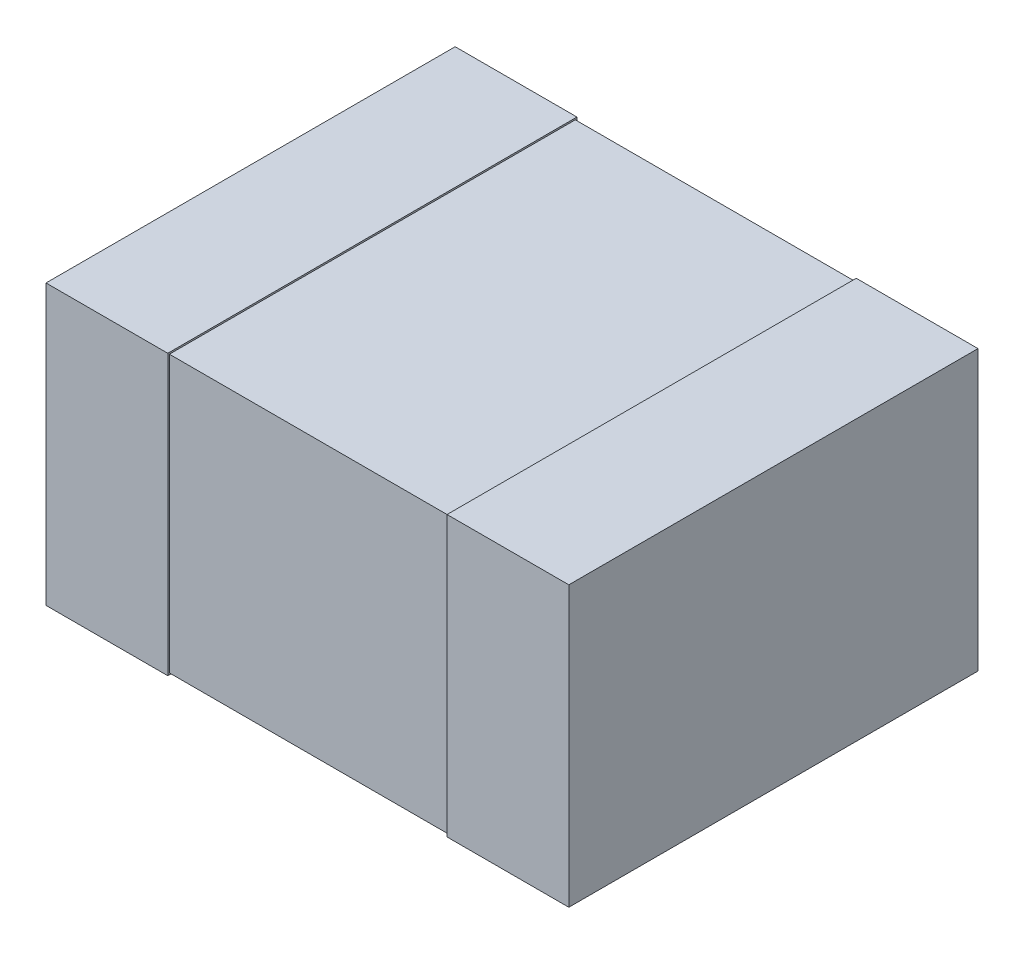
ISO-10303-21;
HEADER;
FILE_DESCRIPTION(('STEP AP214'),'2;1');
FILE_NAME('part.step','',(''),(''),'','','');
FILE_SCHEMA(('AUTOMOTIVE_DESIGN { 1 0 10303 214 1 1 1 1 }'));
ENDSEC;
DATA;
#1=APPLICATION_CONTEXT('core data for automotive mechanical design processes');
#2=APPLICATION_PROTOCOL_DEFINITION('international standard','automotive_design',2000,#1);
#3=PRODUCT_CONTEXT('',#1,'mechanical');
#4=PRODUCT('Part','Part','',(#3));
#5=PRODUCT_RELATED_PRODUCT_CATEGORY('part','',(#4));
#6=PRODUCT_DEFINITION_FORMATION('','',#4);
#7=PRODUCT_DEFINITION_CONTEXT('part definition',#1,'design');
#8=PRODUCT_DEFINITION('design','',#6,#7);
#9=PRODUCT_DEFINITION_SHAPE('','',#8);
#10=(LENGTH_UNIT() NAMED_UNIT(*) SI_UNIT(.MILLI.,.METRE.));
#11=(NAMED_UNIT(*) PLANE_ANGLE_UNIT() SI_UNIT($,.RADIAN.));
#12=(NAMED_UNIT(*) SI_UNIT($,.STERADIAN.) SOLID_ANGLE_UNIT());
#13=UNCERTAINTY_MEASURE_WITH_UNIT(LENGTH_MEASURE(1.E-05),#10,'distance_accuracy_value','');
#14=(GEOMETRIC_REPRESENTATION_CONTEXT(3) GLOBAL_UNCERTAINTY_ASSIGNED_CONTEXT((#13)) GLOBAL_UNIT_ASSIGNED_CONTEXT((#10,
#11,#12)) REPRESENTATION_CONTEXT('',''));
#15=CARTESIAN_POINT('',(0.,0.,0.));
#16=DIRECTION('',(0.,0.,1.));
#17=DIRECTION('',(1.,0.,0.));
#18=AXIS2_PLACEMENT_3D('',#15,#16,#17);
#19=CARTESIAN_POINT('',(1.61,1.71,-1.26));
#20=DIRECTION('',(-1.,0.,0.));
#21=DIRECTION('',(0.,0.,1.));
#22=AXIS2_PLACEMENT_3D('',#19,#20,#21);
#23=PLANE('',#22);
#24=DIRECTION('',(0.,0.,-1.));
#25=VECTOR('',#24,1.);
#26=CARTESIAN_POINT('',(1.61,-0.01,0.));
#27=LINE('',#26,#25);
#28=CARTESIAN_POINT('',(1.61,-0.01,-1.26));
#29=VERTEX_POINT('',#28);
#30=CARTESIAN_POINT('',(1.61,-0.01,1.26));
#31=VERTEX_POINT('',#30);
#32=EDGE_CURVE('E102',#29,#31,#27,.F.);
#33=ORIENTED_EDGE('',*,*,#32,.F.);
#34=DIRECTION('',(0.,1.,0.));
#35=VECTOR('',#34,1.);
#36=CARTESIAN_POINT('',(1.61,1.71,-1.26));
#37=LINE('',#36,#35);
#38=CARTESIAN_POINT('',(1.61,1.71,-1.26));
#39=VERTEX_POINT('',#38);
#40=EDGE_CURVE('E20',#39,#29,#37,.F.);
#41=ORIENTED_EDGE('',*,*,#40,.F.);
#42=DIRECTION('',(0.,0.,-1.));
#43=VECTOR('',#42,1.);
#44=CARTESIAN_POINT('',(1.61,1.71,0.));
#45=LINE('',#44,#43);
#46=CARTESIAN_POINT('',(1.61,1.71,1.26));
#47=VERTEX_POINT('',#46);
#48=EDGE_CURVE('E107',#39,#47,#45,.F.);
#49=ORIENTED_EDGE('',*,*,#48,.T.);
#50=DIRECTION('',(0.,1.,0.));
#51=VECTOR('',#50,1.);
#52=CARTESIAN_POINT('',(1.61,1.71,1.26));
#53=LINE('',#52,#51);
#54=EDGE_CURVE('E109',#47,#31,#53,.F.);
#55=ORIENTED_EDGE('',*,*,#54,.T.);
#56=EDGE_LOOP('',(#33,#41,#49,#55));
#57=FACE_BOUND('',#56,.T.);
#58=ADVANCED_FACE('F17',(#57),#23,.F.);
#59=CARTESIAN_POINT('',(0.,1.71,0.));
#60=DIRECTION('',(0.,-1.,0.));
#61=DIRECTION('',(0.,0.,-1.));
#62=AXIS2_PLACEMENT_3D('',#59,#60,#61);
#63=PLANE('',#62);
#64=DIRECTION('',(1.,0.,0.));
#65=VECTOR('',#64,1.);
#66=CARTESIAN_POINT('',(1.61,1.71,-1.26));
#67=LINE('',#66,#65);
#68=CARTESIAN_POINT('',(0.86,1.71,-1.26));
#69=VERTEX_POINT('',#68);
#70=EDGE_CURVE('E129',#39,#69,#67,.F.);
#71=ORIENTED_EDGE('',*,*,#70,.T.);
#72=DIRECTION('',(0.,0.,-1.));
#73=VECTOR('',#72,1.);
#74=CARTESIAN_POINT('',(0.86,1.71,-1.26));
#75=LINE('',#74,#73);
#76=CARTESIAN_POINT('',(0.86,1.71,1.26));
#77=VERTEX_POINT('',#76);
#78=EDGE_CURVE('E124',#69,#77,#75,.F.);
#79=ORIENTED_EDGE('',*,*,#78,.T.);
#80=DIRECTION('',(-1.,0.,0.));
#81=VECTOR('',#80,1.);
#82=CARTESIAN_POINT('',(1.61,1.71,1.26));
#83=LINE('',#82,#81);
#84=EDGE_CURVE('E115',#77,#47,#83,.F.);
#85=ORIENTED_EDGE('',*,*,#84,.T.);
#86=ORIENTED_EDGE('',*,*,#48,.F.);
#87=EDGE_LOOP('',(#71,#79,#85,#86));
#88=FACE_BOUND('',#87,.T.);
#89=ADVANCED_FACE('F123',(#88),#63,.F.);
#90=CARTESIAN_POINT('',(1.61,1.71,1.26));
#91=DIRECTION('',(0.,0.,-1.));
#92=DIRECTION('',(-1.,0.,0.));
#93=AXIS2_PLACEMENT_3D('',#90,#91,#92);
#94=PLANE('',#93);
#95=DIRECTION('',(1.,0.,0.));
#96=VECTOR('',#95,1.);
#97=CARTESIAN_POINT('',(0.,-0.01,1.26));
#98=LINE('',#97,#96);
#99=CARTESIAN_POINT('',(0.86,-0.01,1.26));
#100=VERTEX_POINT('',#99);
#101=EDGE_CURVE('E120',#31,#100,#98,.F.);
#102=ORIENTED_EDGE('',*,*,#101,.F.);
#103=ORIENTED_EDGE('',*,*,#54,.F.);
#104=ORIENTED_EDGE('',*,*,#84,.F.);
#105=DIRECTION('',(0.,1.,0.));
#106=VECTOR('',#105,1.);
#107=CARTESIAN_POINT('',(0.86,1.71,1.26));
#108=LINE('',#107,#106);
#109=EDGE_CURVE('E134',#77,#100,#108,.F.);
#110=ORIENTED_EDGE('',*,*,#109,.T.);
#111=EDGE_LOOP('',(#102,#103,#104,#110));
#112=FACE_BOUND('',#111,.T.);
#113=ADVANCED_FACE('F117',(#112),#94,.F.);
#114=CARTESIAN_POINT('',(0.,-0.01,0.));
#115=DIRECTION('',(0.,-1.,0.));
#116=DIRECTION('',(0.,0.,-1.));
#117=AXIS2_PLACEMENT_3D('',#114,#115,#116);
#118=PLANE('',#117);
#119=DIRECTION('',(0.,0.,-1.));
#120=VECTOR('',#119,1.);
#121=CARTESIAN_POINT('',(0.86,-0.01,-1.26));
#122=LINE('',#121,#120);
#123=CARTESIAN_POINT('',(0.86,-0.01,-1.26));
#124=VERTEX_POINT('',#123);
#125=EDGE_CURVE('E136',#100,#124,#122,.T.);
#126=ORIENTED_EDGE('',*,*,#125,.T.);
#127=DIRECTION('',(1.,0.,0.));
#128=VECTOR('',#127,1.);
#129=CARTESIAN_POINT('',(1.61,-0.01,-1.26));
#130=LINE('',#129,#128);
#131=EDGE_CURVE('E131',#124,#29,#130,.T.);
#132=ORIENTED_EDGE('',*,*,#131,.T.);
#133=ORIENTED_EDGE('',*,*,#32,.T.);
#134=ORIENTED_EDGE('',*,*,#101,.T.);
#135=EDGE_LOOP('',(#126,#132,#133,#134));
#136=FACE_BOUND('',#135,.T.);
#137=ADVANCED_FACE('F258',(#136),#118,.T.);
#138=CARTESIAN_POINT('',(1.61,1.71,-1.26));
#139=DIRECTION('',(0.,0.,1.));
#140=DIRECTION('',(1.,0.,0.));
#141=AXIS2_PLACEMENT_3D('',#138,#139,#140);
#142=PLANE('',#141);
#143=ORIENTED_EDGE('',*,*,#131,.F.);
#144=DIRECTION('',(0.,1.,0.));
#145=VECTOR('',#144,1.);
#146=CARTESIAN_POINT('',(0.86,1.71,-1.26));
#147=LINE('',#146,#145);
#148=EDGE_CURVE('E139',#124,#69,#147,.T.);
#149=ORIENTED_EDGE('',*,*,#148,.T.);
#150=ORIENTED_EDGE('',*,*,#70,.F.);
#151=ORIENTED_EDGE('',*,*,#40,.T.);
#152=EDGE_LOOP('',(#143,#149,#150,#151));
#153=FACE_BOUND('',#152,.T.);
#154=ADVANCED_FACE('F254',(#153),#142,.F.);
#155=CARTESIAN_POINT('',(0.86,1.71,-1.26));
#156=DIRECTION('',(1.,0.,0.));
#157=DIRECTION('',(0.,0.,-1.));
#158=AXIS2_PLACEMENT_3D('',#155,#156,#157);
#159=PLANE('',#158);
#160=DIRECTION('',(0.,0.,-1.));
#161=VECTOR('',#160,1.);
#162=CARTESIAN_POINT('',(0.86,1.7,0.));
#163=LINE('',#162,#161);
#164=CARTESIAN_POINT('',(0.86,1.7,-1.25));
#165=VERTEX_POINT('',#164);
#166=CARTESIAN_POINT('',(0.86,1.7,1.25));
#167=VERTEX_POINT('',#166);
#168=EDGE_CURVE('E155',#165,#167,#163,.F.);
#169=ORIENTED_EDGE('',*,*,#168,.T.);
#170=DIRECTION('',(0.,1.,0.));
#171=VECTOR('',#170,1.);
#172=CARTESIAN_POINT('',(0.86,1.71,1.25));
#173=LINE('',#172,#171);
#174=CARTESIAN_POINT('',(0.86,0.,1.25));
#175=VERTEX_POINT('',#174);
#176=EDGE_CURVE('E142',#175,#167,#173,.T.);
#177=ORIENTED_EDGE('',*,*,#176,.F.);
#178=DIRECTION('',(0.,0.,-1.));
#179=VECTOR('',#178,1.);
#180=CARTESIAN_POINT('',(0.86,0.,0.));
#181=LINE('',#180,#179);
#182=CARTESIAN_POINT('',(0.86,0.,-1.25));
#183=VERTEX_POINT('',#182);
#184=EDGE_CURVE('E144',#183,#175,#181,.F.);
#185=ORIENTED_EDGE('',*,*,#184,.F.);
#186=DIRECTION('',(0.,1.,0.));
#187=VECTOR('',#186,1.);
#188=CARTESIAN_POINT('',(0.86,1.7,-1.25));
#189=LINE('',#188,#187);
#190=EDGE_CURVE('E150',#183,#165,#189,.T.);
#191=ORIENTED_EDGE('',*,*,#190,.T.);
#192=EDGE_LOOP('',(#169,#177,#185,#191));
#193=FACE_BOUND('',#192,.T.);
#194=ORIENTED_EDGE('',*,*,#125,.F.);
#195=ORIENTED_EDGE('',*,*,#109,.F.);
#196=ORIENTED_EDGE('',*,*,#78,.F.);
#197=ORIENTED_EDGE('',*,*,#148,.F.);
#198=EDGE_LOOP('',(#194,#195,#196,#197));
#199=FACE_BOUND('',#198,.T.);
#200=ADVANCED_FACE('F250',(#193,#199),#159,.F.);
#201=CARTESIAN_POINT('',(0.,0.,0.));
#202=DIRECTION('',(0.,-1.,0.));
#203=DIRECTION('',(0.,0.,-1.));
#204=AXIS2_PLACEMENT_3D('',#201,#202,#203);
#205=PLANE('',#204);
#206=DIRECTION('',(-1.,0.,0.));
#207=VECTOR('',#206,1.);
#208=CARTESIAN_POINT('',(-1.6,0.,1.25));
#209=LINE('',#208,#207);
#210=CARTESIAN_POINT('',(-0.86,0.,1.25));
#211=VERTEX_POINT('',#210);
#212=EDGE_CURVE('E158',#175,#211,#209,.T.);
#213=ORIENTED_EDGE('',*,*,#212,.T.);
#214=DIRECTION('',(0.,0.,1.));
#215=VECTOR('',#214,1.);
#216=CARTESIAN_POINT('',(-0.86,0.,-1.26));
#217=LINE('',#216,#215);
#218=CARTESIAN_POINT('',(-0.86,0.,-1.25));
#219=VERTEX_POINT('',#218);
#220=EDGE_CURVE('E166',#211,#219,#217,.F.);
#221=ORIENTED_EDGE('',*,*,#220,.T.);
#222=DIRECTION('',(1.,0.,0.));
#223=VECTOR('',#222,1.);
#224=CARTESIAN_POINT('',(-1.6,0.,-1.25));
#225=LINE('',#224,#223);
#226=EDGE_CURVE('E147',#219,#183,#225,.T.);
#227=ORIENTED_EDGE('',*,*,#226,.T.);
#228=ORIENTED_EDGE('',*,*,#184,.T.);
#229=EDGE_LOOP('',(#213,#221,#227,#228));
#230=FACE_BOUND('',#229,.T.);
#231=ADVANCED_FACE('F246',(#230),#205,.T.);
#232=CARTESIAN_POINT('',(-1.6,1.7,-1.25));
#233=DIRECTION('',(0.,0.,1.));
#234=DIRECTION('',(1.,0.,0.));
#235=AXIS2_PLACEMENT_3D('',#232,#233,#234);
#236=PLANE('',#235);
#237=ORIENTED_EDGE('',*,*,#226,.F.);
#238=DIRECTION('',(0.,1.,0.));
#239=VECTOR('',#238,1.);
#240=CARTESIAN_POINT('',(-0.86,1.71,-1.25));
#241=LINE('',#240,#239);
#242=CARTESIAN_POINT('',(-0.86,1.7,-1.25));
#243=VERTEX_POINT('',#242);
#244=EDGE_CURVE('E169',#219,#243,#241,.T.);
#245=ORIENTED_EDGE('',*,*,#244,.T.);
#246=DIRECTION('',(1.,0.,0.));
#247=VECTOR('',#246,1.);
#248=CARTESIAN_POINT('',(0.,1.7,-1.25));
#249=LINE('',#248,#247);
#250=EDGE_CURVE('E152',#243,#165,#249,.T.);
#251=ORIENTED_EDGE('',*,*,#250,.T.);
#252=ORIENTED_EDGE('',*,*,#190,.F.);
#253=EDGE_LOOP('',(#237,#245,#251,#252));
#254=FACE_BOUND('',#253,.T.);
#255=ADVANCED_FACE('F242',(#254),#236,.F.);
#256=CARTESIAN_POINT('',(0.,1.7,0.));
#257=DIRECTION('',(0.,-1.,0.));
#258=DIRECTION('',(0.,0.,-1.));
#259=AXIS2_PLACEMENT_3D('',#256,#257,#258);
#260=PLANE('',#259);
#261=ORIENTED_EDGE('',*,*,#250,.F.);
#262=DIRECTION('',(0.,0.,1.));
#263=VECTOR('',#262,1.);
#264=CARTESIAN_POINT('',(-0.86,1.7,-1.26));
#265=LINE('',#264,#263);
#266=CARTESIAN_POINT('',(-0.86,1.7,1.25));
#267=VERTEX_POINT('',#266);
#268=EDGE_CURVE('E172',#243,#267,#265,.T.);
#269=ORIENTED_EDGE('',*,*,#268,.T.);
#270=DIRECTION('',(-1.,0.,0.));
#271=VECTOR('',#270,1.);
#272=CARTESIAN_POINT('',(-1.6,1.7,1.25));
#273=LINE('',#272,#271);
#274=EDGE_CURVE('E161',#267,#167,#273,.F.);
#275=ORIENTED_EDGE('',*,*,#274,.T.);
#276=ORIENTED_EDGE('',*,*,#168,.F.);
#277=EDGE_LOOP('',(#261,#269,#275,#276));
#278=FACE_BOUND('',#277,.T.);
#279=ADVANCED_FACE('F238',(#278),#260,.F.);
#280=CARTESIAN_POINT('',(-1.6,1.7,1.25));
#281=DIRECTION('',(0.,0.,-1.));
#282=DIRECTION('',(-1.,0.,0.));
#283=AXIS2_PLACEMENT_3D('',#280,#281,#282);
#284=PLANE('',#283);
#285=ORIENTED_EDGE('',*,*,#274,.F.);
#286=DIRECTION('',(0.,1.,0.));
#287=VECTOR('',#286,1.);
#288=CARTESIAN_POINT('',(-0.86,1.71,1.25));
#289=LINE('',#288,#287);
#290=EDGE_CURVE('E175',#267,#211,#289,.F.);
#291=ORIENTED_EDGE('',*,*,#290,.T.);
#292=ORIENTED_EDGE('',*,*,#212,.F.);
#293=ORIENTED_EDGE('',*,*,#176,.T.);
#294=EDGE_LOOP('',(#285,#291,#292,#293));
#295=FACE_BOUND('',#294,.T.);
#296=ADVANCED_FACE('F234',(#295),#284,.F.);
#297=CARTESIAN_POINT('',(-0.86,1.71,-1.26));
#298=DIRECTION('',(-1.,0.,0.));
#299=DIRECTION('',(0.,0.,1.));
#300=AXIS2_PLACEMENT_3D('',#297,#298,#299);
#301=PLANE('',#300);
#302=ORIENTED_EDGE('',*,*,#268,.F.);
#303=ORIENTED_EDGE('',*,*,#244,.F.);
#304=ORIENTED_EDGE('',*,*,#220,.F.);
#305=ORIENTED_EDGE('',*,*,#290,.F.);
#306=EDGE_LOOP('',(#302,#303,#304,#305));
#307=FACE_BOUND('',#306,.T.);
#308=DIRECTION('',(0.,0.,1.));
#309=VECTOR('',#308,1.);
#310=CARTESIAN_POINT('',(-0.86,-0.01,0.));
#311=LINE('',#310,#309);
#312=CARTESIAN_POINT('',(-0.86,-0.01,1.26));
#313=VERTEX_POINT('',#312);
#314=CARTESIAN_POINT('',(-0.86,-0.01,-1.26));
#315=VERTEX_POINT('',#314);
#316=EDGE_CURVE('E189',#313,#315,#311,.F.);
#317=ORIENTED_EDGE('',*,*,#316,.T.);
#318=DIRECTION('',(0.,1.,0.));
#319=VECTOR('',#318,1.);
#320=CARTESIAN_POINT('',(-0.86,1.71,-1.26));
#321=LINE('',#320,#319);
#322=CARTESIAN_POINT('',(-0.86,1.71,-1.26));
#323=VERTEX_POINT('',#322);
#324=EDGE_CURVE('E164',#323,#315,#321,.F.);
#325=ORIENTED_EDGE('',*,*,#324,.F.);
#326=DIRECTION('',(0.,0.,1.));
#327=VECTOR('',#326,1.);
#328=CARTESIAN_POINT('',(-0.86,1.71,0.));
#329=LINE('',#328,#327);
#330=CARTESIAN_POINT('',(-0.86,1.71,1.26));
#331=VERTEX_POINT('',#330);
#332=EDGE_CURVE('E178',#331,#323,#329,.F.);
#333=ORIENTED_EDGE('',*,*,#332,.F.);
#334=DIRECTION('',(0.,1.,0.));
#335=VECTOR('',#334,1.);
#336=CARTESIAN_POINT('',(-0.86,1.71,1.26));
#337=LINE('',#336,#335);
#338=EDGE_CURVE('E184',#331,#313,#337,.F.);
#339=ORIENTED_EDGE('',*,*,#338,.T.);
#340=EDGE_LOOP('',(#317,#325,#333,#339));
#341=FACE_BOUND('',#340,.T.);
#342=ADVANCED_FACE('F231',(#307,#341),#301,.F.);
#343=CARTESIAN_POINT('',(0.,1.71,0.));
#344=DIRECTION('',(0.,1.,0.));
#345=DIRECTION('',(0.,0.,1.));
#346=AXIS2_PLACEMENT_3D('',#343,#344,#345);
#347=PLANE('',#346);
#348=ORIENTED_EDGE('',*,*,#332,.T.);
#349=DIRECTION('',(1.,0.,0.));
#350=VECTOR('',#349,1.);
#351=CARTESIAN_POINT('',(-1.61,1.71,-1.26));
#352=LINE('',#351,#350);
#353=CARTESIAN_POINT('',(-1.61,1.71,-1.26));
#354=VERTEX_POINT('',#353);
#355=EDGE_CURVE('E192',#323,#354,#352,.F.);
#356=ORIENTED_EDGE('',*,*,#355,.T.);
#357=DIRECTION('',(0.,0.,-1.));
#358=VECTOR('',#357,1.);
#359=CARTESIAN_POINT('',(-1.61,1.71,-1.26));
#360=LINE('',#359,#358);
#361=CARTESIAN_POINT('',(-1.61,1.71,1.26));
#362=VERTEX_POINT('',#361);
#363=EDGE_CURVE('E196',#354,#362,#360,.F.);
#364=ORIENTED_EDGE('',*,*,#363,.T.);
#365=DIRECTION('',(-1.,0.,0.));
#366=VECTOR('',#365,1.);
#367=CARTESIAN_POINT('',(-1.61,1.71,1.26));
#368=LINE('',#367,#366);
#369=EDGE_CURVE('E181',#362,#331,#368,.F.);
#370=ORIENTED_EDGE('',*,*,#369,.T.);
#371=EDGE_LOOP('',(#348,#356,#364,#370));
#372=FACE_BOUND('',#371,.T.);
#373=ADVANCED_FACE('F214',(#372),#347,.T.);
#374=CARTESIAN_POINT('',(-1.61,1.71,1.26));
#375=DIRECTION('',(0.,0.,-1.));
#376=DIRECTION('',(-1.,0.,0.));
#377=AXIS2_PLACEMENT_3D('',#374,#375,#376);
#378=PLANE('',#377);
#379=DIRECTION('',(1.,0.,0.));
#380=VECTOR('',#379,1.);
#381=CARTESIAN_POINT('',(0.,-0.01,1.26));
#382=LINE('',#381,#380);
#383=CARTESIAN_POINT('',(-1.61,-0.01,1.26));
#384=VERTEX_POINT('',#383);
#385=EDGE_CURVE('E186',#384,#313,#382,.T.);
#386=ORIENTED_EDGE('',*,*,#385,.T.);
#387=ORIENTED_EDGE('',*,*,#338,.F.);
#388=ORIENTED_EDGE('',*,*,#369,.F.);
#389=DIRECTION('',(0.,1.,0.));
#390=VECTOR('',#389,1.);
#391=CARTESIAN_POINT('',(-1.61,1.71,1.26));
#392=LINE('',#391,#390);
#393=EDGE_CURVE('E199',#362,#384,#392,.F.);
#394=ORIENTED_EDGE('',*,*,#393,.T.);
#395=EDGE_LOOP('',(#386,#387,#388,#394));
#396=FACE_BOUND('',#395,.T.);
#397=ADVANCED_FACE('F211',(#396),#378,.F.);
#398=CARTESIAN_POINT('',(0.,-0.01,0.));
#399=DIRECTION('',(0.,1.,0.));
#400=DIRECTION('',(0.,0.,1.));
#401=AXIS2_PLACEMENT_3D('',#398,#399,#400);
#402=PLANE('',#401);
#403=DIRECTION('',(1.,0.,0.));
#404=VECTOR('',#403,1.);
#405=CARTESIAN_POINT('',(-1.61,-0.01,-1.26));
#406=LINE('',#405,#404);
#407=CARTESIAN_POINT('',(-1.61,-0.01,-1.26));
#408=VERTEX_POINT('',#407);
#409=EDGE_CURVE('E34',#408,#315,#406,.T.);
#410=ORIENTED_EDGE('',*,*,#409,.T.);
#411=ORIENTED_EDGE('',*,*,#316,.F.);
#412=ORIENTED_EDGE('',*,*,#385,.F.);
#413=DIRECTION('',(0.,0.,-1.));
#414=VECTOR('',#413,1.);
#415=CARTESIAN_POINT('',(-1.61,-0.01,-1.26));
#416=LINE('',#415,#414);
#417=EDGE_CURVE('E26',#384,#408,#416,.T.);
#418=ORIENTED_EDGE('',*,*,#417,.T.);
#419=EDGE_LOOP('',(#410,#411,#412,#418));
#420=FACE_BOUND('',#419,.T.);
#421=ADVANCED_FACE('F205',(#420),#402,.F.);
#422=CARTESIAN_POINT('',(-1.61,1.71,-1.26));
#423=DIRECTION('',(0.,0.,1.));
#424=DIRECTION('',(1.,0.,0.));
#425=AXIS2_PLACEMENT_3D('',#422,#423,#424);
#426=PLANE('',#425);
#427=ORIENTED_EDGE('',*,*,#409,.F.);
#428=DIRECTION('',(0.,1.,0.));
#429=VECTOR('',#428,1.);
#430=CARTESIAN_POINT('',(-1.61,1.71,-1.26));
#431=LINE('',#430,#429);
#432=EDGE_CURVE('E11',#408,#354,#431,.T.);
#433=ORIENTED_EDGE('',*,*,#432,.T.);
#434=ORIENTED_EDGE('',*,*,#355,.F.);
#435=ORIENTED_EDGE('',*,*,#324,.T.);
#436=EDGE_LOOP('',(#427,#433,#434,#435));
#437=FACE_BOUND('',#436,.T.);
#438=ADVANCED_FACE('F216',(#437),#426,.F.);
#439=CARTESIAN_POINT('',(-1.61,1.71,-1.26));
#440=DIRECTION('',(1.,0.,0.));
#441=DIRECTION('',(0.,0.,-1.));
#442=AXIS2_PLACEMENT_3D('',#439,#440,#441);
#443=PLANE('',#442);
#444=ORIENTED_EDGE('',*,*,#417,.F.);
#445=ORIENTED_EDGE('',*,*,#393,.F.);
#446=ORIENTED_EDGE('',*,*,#363,.F.);
#447=ORIENTED_EDGE('',*,*,#432,.F.);
#448=EDGE_LOOP('',(#444,#445,#446,#447));
#449=FACE_BOUND('',#448,.T.);
#450=ADVANCED_FACE('F209',(#449),#443,.F.);
#451=CLOSED_SHELL('',(#58,#89,#113,#137,#154,#200,#231,#255,#279,#296,#342,#373,#397,#421,#438,#450));
#452=MANIFOLD_SOLID_BREP('B1',#451);
#453=ADVANCED_BREP_SHAPE_REPRESENTATION('',(#18,#452),#14);
#454=SHAPE_DEFINITION_REPRESENTATION(#9,#453);
ENDSEC;
END-ISO-10303-21;
